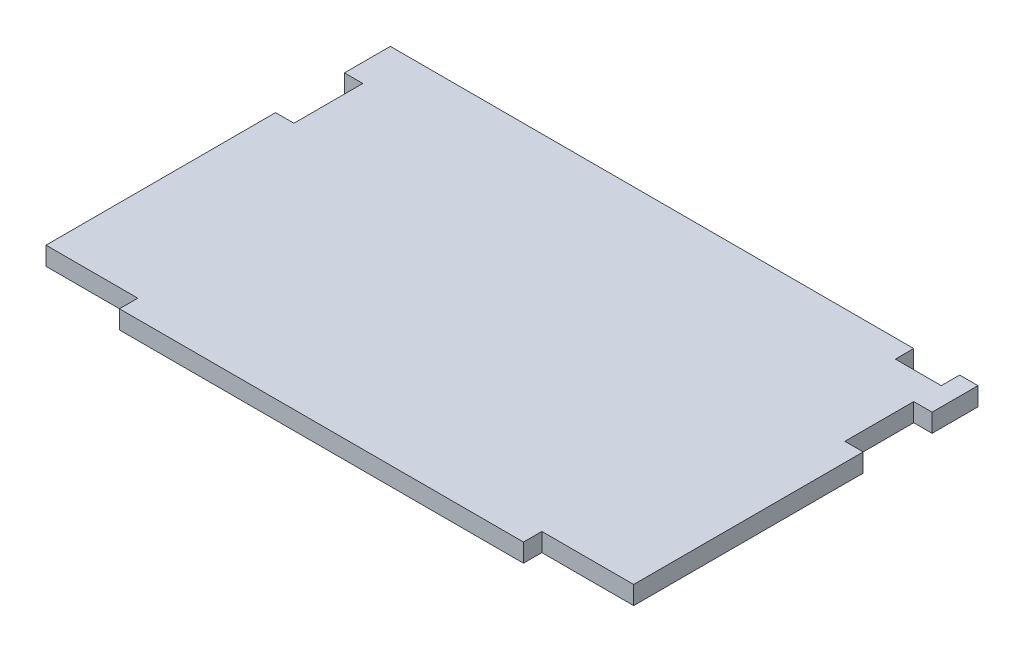
ISO-10303-21;
HEADER;
FILE_DESCRIPTION(('STEP AP214'),'2;1');
FILE_NAME('part.step','',(''),(''),'','','');
FILE_SCHEMA(('AUTOMOTIVE_DESIGN { 1 0 10303 214 1 1 1 1 }'));
ENDSEC;
DATA;
#1=APPLICATION_CONTEXT('core data for automotive mechanical design processes');
#2=APPLICATION_PROTOCOL_DEFINITION('international standard','automotive_design',2000,#1);
#3=PRODUCT_CONTEXT('',#1,'mechanical');
#4=PRODUCT('Part','Part','',(#3));
#5=PRODUCT_RELATED_PRODUCT_CATEGORY('part','',(#4));
#6=PRODUCT_DEFINITION_FORMATION('','',#4);
#7=PRODUCT_DEFINITION_CONTEXT('part definition',#1,'design');
#8=PRODUCT_DEFINITION('design','',#6,#7);
#9=PRODUCT_DEFINITION_SHAPE('','',#8);
#10=(LENGTH_UNIT() NAMED_UNIT(*) SI_UNIT(.MILLI.,.METRE.));
#11=(NAMED_UNIT(*) PLANE_ANGLE_UNIT() SI_UNIT($,.RADIAN.));
#12=(NAMED_UNIT(*) SI_UNIT($,.STERADIAN.) SOLID_ANGLE_UNIT());
#13=UNCERTAINTY_MEASURE_WITH_UNIT(LENGTH_MEASURE(1.E-05),#10,'distance_accuracy_value','');
#14=(GEOMETRIC_REPRESENTATION_CONTEXT(3) GLOBAL_UNCERTAINTY_ASSIGNED_CONTEXT((#13)) GLOBAL_UNIT_ASSIGNED_CONTEXT((#10,
#11,#12)) REPRESENTATION_CONTEXT('',''));
#15=CARTESIAN_POINT('',(0.,0.,0.));
#16=DIRECTION('',(0.,0.,1.));
#17=DIRECTION('',(1.,0.,0.));
#18=AXIS2_PLACEMENT_3D('',#15,#16,#17);
#19=CARTESIAN_POINT('',(0.,4.,0.));
#20=DIRECTION('',(1.,0.,0.));
#21=DIRECTION('',(0.,0.,-1.));
#22=AXIS2_PLACEMENT_3D('',#19,#20,#21);
#23=PLANE('',#22);
#24=DIRECTION('',(0.,0.,1.));
#25=VECTOR('',#24,1.);
#26=CARTESIAN_POINT('',(0.,0.,0.));
#27=LINE('',#26,#25);
#28=CARTESIAN_POINT('',(0.,0.,-50.));
#29=VERTEX_POINT('',#28);
#30=CARTESIAN_POINT('',(0.,0.,0.));
#31=VERTEX_POINT('',#30);
#32=EDGE_CURVE('E200',#29,#31,#27,.T.);
#33=ORIENTED_EDGE('',*,*,#32,.T.);
#34=DIRECTION('',(0.,-1.,0.));
#35=VECTOR('',#34,1.);
#36=CARTESIAN_POINT('',(0.,4.,0.));
#37=LINE('',#36,#35);
#38=CARTESIAN_POINT('',(0.,4.,0.));
#39=VERTEX_POINT('',#38);
#40=EDGE_CURVE('E11',#39,#31,#37,.T.);
#41=ORIENTED_EDGE('',*,*,#40,.F.);
#42=DIRECTION('',(0.,0.,1.));
#43=VECTOR('',#42,1.);
#44=CARTESIAN_POINT('',(0.,4.,0.));
#45=LINE('',#44,#43);
#46=CARTESIAN_POINT('',(0.,4.,-50.));
#47=VERTEX_POINT('',#46);
#48=EDGE_CURVE('E238',#47,#39,#45,.T.);
#49=ORIENTED_EDGE('',*,*,#48,.F.);
#50=DIRECTION('',(0.,-1.,0.));
#51=VECTOR('',#50,1.);
#52=CARTESIAN_POINT('',(0.,4.,-50.));
#53=LINE('',#52,#51);
#54=EDGE_CURVE('E196',#47,#29,#53,.T.);
#55=ORIENTED_EDGE('',*,*,#54,.T.);
#56=EDGE_LOOP('',(#33,#41,#49,#55));
#57=FACE_BOUND('',#56,.T.);
#58=ADVANCED_FACE('F32',(#57),#23,.F.);
#59=CARTESIAN_POINT('',(0.,4.,0.));
#60=DIRECTION('',(0.,0.,-1.));
#61=DIRECTION('',(-1.,0.,0.));
#62=AXIS2_PLACEMENT_3D('',#59,#60,#61);
#63=PLANE('',#62);
#64=DIRECTION('',(1.,0.,0.));
#65=VECTOR('',#64,1.);
#66=CARTESIAN_POINT('',(0.,0.,0.));
#67=LINE('',#66,#65);
#68=CARTESIAN_POINT('',(20.,0.,0.));
#69=VERTEX_POINT('',#68);
#70=EDGE_CURVE('E203',#31,#69,#67,.T.);
#71=ORIENTED_EDGE('',*,*,#70,.T.);
#72=DIRECTION('',(0.,-1.,0.));
#73=VECTOR('',#72,1.);
#74=CARTESIAN_POINT('',(20.,4.,0.));
#75=LINE('',#74,#73);
#76=CARTESIAN_POINT('',(20.,4.,0.));
#77=VERTEX_POINT('',#76);
#78=EDGE_CURVE('E40',#77,#69,#75,.T.);
#79=ORIENTED_EDGE('',*,*,#78,.F.);
#80=DIRECTION('',(1.,0.,0.));
#81=VECTOR('',#80,1.);
#82=CARTESIAN_POINT('',(0.,4.,0.));
#83=LINE('',#82,#81);
#84=EDGE_CURVE('E127',#39,#77,#83,.T.);
#85=ORIENTED_EDGE('',*,*,#84,.F.);
#86=ORIENTED_EDGE('',*,*,#40,.T.);
#87=EDGE_LOOP('',(#71,#79,#85,#86));
#88=FACE_BOUND('',#87,.T.);
#89=ADVANCED_FACE('F356',(#88),#63,.F.);
#90=CARTESIAN_POINT('',(20.,4.,0.));
#91=DIRECTION('',(1.,0.,0.));
#92=DIRECTION('',(0.,0.,-1.));
#93=AXIS2_PLACEMENT_3D('',#90,#91,#92);
#94=PLANE('',#93);
#95=DIRECTION('',(0.,0.,1.));
#96=VECTOR('',#95,1.);
#97=CARTESIAN_POINT('',(20.,0.,0.));
#98=LINE('',#97,#96);
#99=CARTESIAN_POINT('',(20.,0.,4.00000000000001));
#100=VERTEX_POINT('',#99);
#101=EDGE_CURVE('E205',#69,#100,#98,.T.);
#102=ORIENTED_EDGE('',*,*,#101,.T.);
#103=DIRECTION('',(0.,-1.,0.));
#104=VECTOR('',#103,1.);
#105=CARTESIAN_POINT('',(20.,4.,4.00000000000001));
#106=LINE('',#105,#104);
#107=CARTESIAN_POINT('',(20.,4.,4.00000000000001));
#108=VERTEX_POINT('',#107);
#109=EDGE_CURVE('E281',#108,#100,#106,.T.);
#110=ORIENTED_EDGE('',*,*,#109,.F.);
#111=DIRECTION('',(0.,0.,1.));
#112=VECTOR('',#111,1.);
#113=CARTESIAN_POINT('',(20.,4.,0.));
#114=LINE('',#113,#112);
#115=EDGE_CURVE('E289',#77,#108,#114,.T.);
#116=ORIENTED_EDGE('',*,*,#115,.F.);
#117=ORIENTED_EDGE('',*,*,#78,.T.);
#118=EDGE_LOOP('',(#102,#110,#116,#117));
#119=FACE_BOUND('',#118,.T.);
#120=ADVANCED_FACE('F287',(#119),#94,.F.);
#121=CARTESIAN_POINT('',(108.,4.,4.));
#122=DIRECTION('',(0.,0.,-1.));
#123=DIRECTION('',(-1.,0.,0.));
#124=AXIS2_PLACEMENT_3D('',#121,#122,#123);
#125=PLANE('',#124);
#126=DIRECTION('',(1.,0.,0.));
#127=VECTOR('',#126,1.);
#128=CARTESIAN_POINT('',(108.,0.,4.));
#129=LINE('',#128,#127);
#130=CARTESIAN_POINT('',(108.,0.,4.));
#131=VERTEX_POINT('',#130);
#132=EDGE_CURVE('E207',#100,#131,#129,.T.);
#133=ORIENTED_EDGE('',*,*,#132,.T.);
#134=DIRECTION('',(0.,-1.,0.));
#135=VECTOR('',#134,1.);
#136=CARTESIAN_POINT('',(108.,4.,4.));
#137=LINE('',#136,#135);
#138=CARTESIAN_POINT('',(108.,4.,4.));
#139=VERTEX_POINT('',#138);
#140=EDGE_CURVE('E278',#139,#131,#137,.T.);
#141=ORIENTED_EDGE('',*,*,#140,.F.);
#142=DIRECTION('',(1.,0.,0.));
#143=VECTOR('',#142,1.);
#144=CARTESIAN_POINT('',(108.,4.,4.));
#145=LINE('',#144,#143);
#146=EDGE_CURVE('E307',#108,#139,#145,.T.);
#147=ORIENTED_EDGE('',*,*,#146,.F.);
#148=ORIENTED_EDGE('',*,*,#109,.T.);
#149=EDGE_LOOP('',(#133,#141,#147,#148));
#150=FACE_BOUND('',#149,.T.);
#151=ADVANCED_FACE('F298',(#150),#125,.F.);
#152=CARTESIAN_POINT('',(108.,4.,0.));
#153=DIRECTION('',(-1.,0.,0.));
#154=DIRECTION('',(0.,0.,1.));
#155=AXIS2_PLACEMENT_3D('',#152,#153,#154);
#156=PLANE('',#155);
#157=DIRECTION('',(0.,0.,-1.));
#158=VECTOR('',#157,1.);
#159=CARTESIAN_POINT('',(108.,0.,0.));
#160=LINE('',#159,#158);
#161=CARTESIAN_POINT('',(108.,0.,0.));
#162=VERTEX_POINT('',#161);
#163=EDGE_CURVE('E209',#131,#162,#160,.T.);
#164=ORIENTED_EDGE('',*,*,#163,.T.);
#165=DIRECTION('',(0.,-1.,0.));
#166=VECTOR('',#165,1.);
#167=CARTESIAN_POINT('',(108.,4.,0.));
#168=LINE('',#167,#166);
#169=CARTESIAN_POINT('',(108.,4.,0.));
#170=VERTEX_POINT('',#169);
#171=EDGE_CURVE('E275',#170,#162,#168,.T.);
#172=ORIENTED_EDGE('',*,*,#171,.F.);
#173=DIRECTION('',(0.,0.,-1.));
#174=VECTOR('',#173,1.);
#175=CARTESIAN_POINT('',(108.,4.,0.));
#176=LINE('',#175,#174);
#177=EDGE_CURVE('E304',#139,#170,#176,.T.);
#178=ORIENTED_EDGE('',*,*,#177,.F.);
#179=ORIENTED_EDGE('',*,*,#140,.T.);
#180=EDGE_LOOP('',(#164,#172,#178,#179));
#181=FACE_BOUND('',#180,.T.);
#182=ADVANCED_FACE('F302',(#181),#156,.F.);
#183=CARTESIAN_POINT('',(108.,4.,0.));
#184=DIRECTION('',(0.,0.,-1.));
#185=DIRECTION('',(-1.,0.,0.));
#186=AXIS2_PLACEMENT_3D('',#183,#184,#185);
#187=PLANE('',#186);
#188=DIRECTION('',(1.,0.,0.));
#189=VECTOR('',#188,1.);
#190=CARTESIAN_POINT('',(108.,0.,0.));
#191=LINE('',#190,#189);
#192=CARTESIAN_POINT('',(128.,0.,0.));
#193=VERTEX_POINT('',#192);
#194=EDGE_CURVE('E211',#162,#193,#191,.T.);
#195=ORIENTED_EDGE('',*,*,#194,.T.);
#196=DIRECTION('',(0.,-1.,0.));
#197=VECTOR('',#196,1.);
#198=CARTESIAN_POINT('',(128.,4.,0.));
#199=LINE('',#198,#197);
#200=CARTESIAN_POINT('',(128.,4.,0.));
#201=VERTEX_POINT('',#200);
#202=EDGE_CURVE('E272',#201,#193,#199,.T.);
#203=ORIENTED_EDGE('',*,*,#202,.F.);
#204=DIRECTION('',(1.,0.,0.));
#205=VECTOR('',#204,1.);
#206=CARTESIAN_POINT('',(108.,4.,0.));
#207=LINE('',#206,#205);
#208=EDGE_CURVE('E306',#170,#201,#207,.T.);
#209=ORIENTED_EDGE('',*,*,#208,.F.);
#210=ORIENTED_EDGE('',*,*,#171,.T.);
#211=EDGE_LOOP('',(#195,#203,#209,#210));
#212=FACE_BOUND('',#211,.T.);
#213=ADVANCED_FACE('F369',(#212),#187,.F.);
#214=CARTESIAN_POINT('',(128.,4.,0.));
#215=DIRECTION('',(-1.,0.,0.));
#216=DIRECTION('',(0.,0.,1.));
#217=AXIS2_PLACEMENT_3D('',#214,#215,#216);
#218=PLANE('',#217);
#219=DIRECTION('',(0.,0.,-1.));
#220=VECTOR('',#219,1.);
#221=CARTESIAN_POINT('',(128.,0.,0.));
#222=LINE('',#221,#220);
#223=CARTESIAN_POINT('',(128.,0.,-50.));
#224=VERTEX_POINT('',#223);
#225=EDGE_CURVE('E213',#193,#224,#222,.T.);
#226=ORIENTED_EDGE('',*,*,#225,.T.);
#227=DIRECTION('',(0.,-1.,0.));
#228=VECTOR('',#227,1.);
#229=CARTESIAN_POINT('',(128.,4.,-50.));
#230=LINE('',#229,#228);
#231=CARTESIAN_POINT('',(128.,4.,-50.));
#232=VERTEX_POINT('',#231);
#233=EDGE_CURVE('E269',#232,#224,#230,.T.);
#234=ORIENTED_EDGE('',*,*,#233,.F.);
#235=DIRECTION('',(0.,0.,-1.));
#236=VECTOR('',#235,1.);
#237=CARTESIAN_POINT('',(128.,4.,0.));
#238=LINE('',#237,#236);
#239=EDGE_CURVE('E309',#201,#232,#238,.T.);
#240=ORIENTED_EDGE('',*,*,#239,.F.);
#241=ORIENTED_EDGE('',*,*,#202,.T.);
#242=EDGE_LOOP('',(#226,#234,#240,#241));
#243=FACE_BOUND('',#242,.T.);
#244=ADVANCED_FACE('F372',(#243),#218,.F.);
#245=CARTESIAN_POINT('',(124.,4.,-50.));
#246=DIRECTION('',(0.,0.,1.));
#247=DIRECTION('',(1.,0.,0.));
#248=AXIS2_PLACEMENT_3D('',#245,#246,#247);
#249=PLANE('',#248);
#250=DIRECTION('',(-1.,0.,0.));
#251=VECTOR('',#250,1.);
#252=CARTESIAN_POINT('',(124.,0.,-50.));
#253=LINE('',#252,#251);
#254=CARTESIAN_POINT('',(124.,0.,-50.));
#255=VERTEX_POINT('',#254);
#256=EDGE_CURVE('E215',#224,#255,#253,.T.);
#257=ORIENTED_EDGE('',*,*,#256,.T.);
#258=DIRECTION('',(0.,-1.,0.));
#259=VECTOR('',#258,1.);
#260=CARTESIAN_POINT('',(124.,4.,-50.));
#261=LINE('',#260,#259);
#262=CARTESIAN_POINT('',(124.,4.,-50.));
#263=VERTEX_POINT('',#262);
#264=EDGE_CURVE('E266',#263,#255,#261,.T.);
#265=ORIENTED_EDGE('',*,*,#264,.F.);
#266=DIRECTION('',(-1.,0.,0.));
#267=VECTOR('',#266,1.);
#268=CARTESIAN_POINT('',(124.,4.,-50.));
#269=LINE('',#268,#267);
#270=EDGE_CURVE('E315',#232,#263,#269,.T.);
#271=ORIENTED_EDGE('',*,*,#270,.F.);
#272=ORIENTED_EDGE('',*,*,#233,.T.);
#273=EDGE_LOOP('',(#257,#265,#271,#272));
#274=FACE_BOUND('',#273,.T.);
#275=ADVANCED_FACE('F376',(#274),#249,.F.);
#276=CARTESIAN_POINT('',(124.,4.,-65.));
#277=DIRECTION('',(-1.,0.,0.));
#278=DIRECTION('',(0.,0.,1.));
#279=AXIS2_PLACEMENT_3D('',#276,#277,#278);
#280=PLANE('',#279);
#281=DIRECTION('',(0.,0.,-1.));
#282=VECTOR('',#281,1.);
#283=CARTESIAN_POINT('',(124.,0.,-65.));
#284=LINE('',#283,#282);
#285=CARTESIAN_POINT('',(124.,0.,-65.));
#286=VERTEX_POINT('',#285);
#287=EDGE_CURVE('E217',#255,#286,#284,.T.);
#288=ORIENTED_EDGE('',*,*,#287,.T.);
#289=DIRECTION('',(0.,-1.,0.));
#290=VECTOR('',#289,1.);
#291=CARTESIAN_POINT('',(124.,4.,-65.));
#292=LINE('',#291,#290);
#293=CARTESIAN_POINT('',(124.,4.,-65.));
#294=VERTEX_POINT('',#293);
#295=EDGE_CURVE('E263',#294,#286,#292,.T.);
#296=ORIENTED_EDGE('',*,*,#295,.F.);
#297=DIRECTION('',(0.,0.,-1.));
#298=VECTOR('',#297,1.);
#299=CARTESIAN_POINT('',(124.,4.,-65.));
#300=LINE('',#299,#298);
#301=EDGE_CURVE('E317',#263,#294,#300,.T.);
#302=ORIENTED_EDGE('',*,*,#301,.F.);
#303=ORIENTED_EDGE('',*,*,#264,.T.);
#304=EDGE_LOOP('',(#288,#296,#302,#303));
#305=FACE_BOUND('',#304,.T.);
#306=ADVANCED_FACE('F380',(#305),#280,.F.);
#307=CARTESIAN_POINT('',(128.,4.,-65.));
#308=DIRECTION('',(0.,0.,-1.));
#309=DIRECTION('',(-1.,0.,0.));
#310=AXIS2_PLACEMENT_3D('',#307,#308,#309);
#311=PLANE('',#310);
#312=DIRECTION('',(1.,0.,0.));
#313=VECTOR('',#312,1.);
#314=CARTESIAN_POINT('',(128.,0.,-65.));
#315=LINE('',#314,#313);
#316=CARTESIAN_POINT('',(128.,0.,-65.));
#317=VERTEX_POINT('',#316);
#318=EDGE_CURVE('E219',#286,#317,#315,.T.);
#319=ORIENTED_EDGE('',*,*,#318,.T.);
#320=DIRECTION('',(0.,-1.,0.));
#321=VECTOR('',#320,1.);
#322=CARTESIAN_POINT('',(128.,4.,-65.));
#323=LINE('',#322,#321);
#324=CARTESIAN_POINT('',(128.,4.,-65.));
#325=VERTEX_POINT('',#324);
#326=EDGE_CURVE('E260',#325,#317,#323,.T.);
#327=ORIENTED_EDGE('',*,*,#326,.F.);
#328=DIRECTION('',(1.,0.,0.));
#329=VECTOR('',#328,1.);
#330=CARTESIAN_POINT('',(128.,4.,-65.));
#331=LINE('',#330,#329);
#332=EDGE_CURVE('E319',#294,#325,#331,.T.);
#333=ORIENTED_EDGE('',*,*,#332,.F.);
#334=ORIENTED_EDGE('',*,*,#295,.T.);
#335=EDGE_LOOP('',(#319,#327,#333,#334));
#336=FACE_BOUND('',#335,.T.);
#337=ADVANCED_FACE('F384',(#336),#311,.F.);
#338=CARTESIAN_POINT('',(128.,4.,-65.));
#339=DIRECTION('',(-1.,0.,0.));
#340=DIRECTION('',(0.,0.,1.));
#341=AXIS2_PLACEMENT_3D('',#338,#339,#340);
#342=PLANE('',#341);
#343=DIRECTION('',(0.,0.,-1.));
#344=VECTOR('',#343,1.);
#345=CARTESIAN_POINT('',(128.,0.,-65.));
#346=LINE('',#345,#344);
#347=CARTESIAN_POINT('',(128.,0.,-75.));
#348=VERTEX_POINT('',#347);
#349=EDGE_CURVE('E221',#317,#348,#346,.T.);
#350=ORIENTED_EDGE('',*,*,#349,.T.);
#351=DIRECTION('',(0.,-1.,0.));
#352=VECTOR('',#351,1.);
#353=CARTESIAN_POINT('',(128.,4.,-75.));
#354=LINE('',#353,#352);
#355=CARTESIAN_POINT('',(128.,4.,-75.));
#356=VERTEX_POINT('',#355);
#357=EDGE_CURVE('E257',#356,#348,#354,.T.);
#358=ORIENTED_EDGE('',*,*,#357,.F.);
#359=DIRECTION('',(0.,0.,-1.));
#360=VECTOR('',#359,1.);
#361=CARTESIAN_POINT('',(128.,4.,-65.));
#362=LINE('',#361,#360);
#363=EDGE_CURVE('E321',#325,#356,#362,.T.);
#364=ORIENTED_EDGE('',*,*,#363,.F.);
#365=ORIENTED_EDGE('',*,*,#326,.T.);
#366=EDGE_LOOP('',(#350,#358,#364,#365));
#367=FACE_BOUND('',#366,.T.);
#368=ADVANCED_FACE('F388',(#367),#342,.F.);
#369=CARTESIAN_POINT('',(124.,4.,-75.));
#370=DIRECTION('',(0.,0.,1.));
#371=DIRECTION('',(1.,0.,0.));
#372=AXIS2_PLACEMENT_3D('',#369,#370,#371);
#373=PLANE('',#372);
#374=DIRECTION('',(-1.,0.,0.));
#375=VECTOR('',#374,1.);
#376=CARTESIAN_POINT('',(124.,0.,-75.));
#377=LINE('',#376,#375);
#378=CARTESIAN_POINT('',(124.,0.,-75.));
#379=VERTEX_POINT('',#378);
#380=EDGE_CURVE('E223',#348,#379,#377,.T.);
#381=ORIENTED_EDGE('',*,*,#380,.T.);
#382=DIRECTION('',(0.,-1.,0.));
#383=VECTOR('',#382,1.);
#384=CARTESIAN_POINT('',(124.,4.,-75.));
#385=LINE('',#384,#383);
#386=CARTESIAN_POINT('',(124.,4.,-75.));
#387=VERTEX_POINT('',#386);
#388=EDGE_CURVE('E254',#387,#379,#385,.T.);
#389=ORIENTED_EDGE('',*,*,#388,.F.);
#390=DIRECTION('',(-1.,0.,0.));
#391=VECTOR('',#390,1.);
#392=CARTESIAN_POINT('',(124.,4.,-75.));
#393=LINE('',#392,#391);
#394=EDGE_CURVE('E323',#356,#387,#393,.T.);
#395=ORIENTED_EDGE('',*,*,#394,.F.);
#396=ORIENTED_EDGE('',*,*,#357,.T.);
#397=EDGE_LOOP('',(#381,#389,#395,#396));
#398=FACE_BOUND('',#397,.T.);
#399=ADVANCED_FACE('F392',(#398),#373,.F.);
#400=CARTESIAN_POINT('',(124.,4.,-75.));
#401=DIRECTION('',(1.,0.,0.));
#402=DIRECTION('',(0.,0.,-1.));
#403=AXIS2_PLACEMENT_3D('',#400,#401,#402);
#404=PLANE('',#403);
#405=DIRECTION('',(0.,0.,1.));
#406=VECTOR('',#405,1.);
#407=CARTESIAN_POINT('',(124.,0.,-75.));
#408=LINE('',#407,#406);
#409=CARTESIAN_POINT('',(124.,0.,-71.));
#410=VERTEX_POINT('',#409);
#411=EDGE_CURVE('E225',#379,#410,#408,.T.);
#412=ORIENTED_EDGE('',*,*,#411,.T.);
#413=DIRECTION('',(0.,-1.,0.));
#414=VECTOR('',#413,1.);
#415=CARTESIAN_POINT('',(124.,4.,-71.));
#416=LINE('',#415,#414);
#417=CARTESIAN_POINT('',(124.,4.,-71.));
#418=VERTEX_POINT('',#417);
#419=EDGE_CURVE('E251',#418,#410,#416,.T.);
#420=ORIENTED_EDGE('',*,*,#419,.F.);
#421=DIRECTION('',(0.,0.,1.));
#422=VECTOR('',#421,1.);
#423=CARTESIAN_POINT('',(124.,4.,-75.));
#424=LINE('',#423,#422);
#425=EDGE_CURVE('E325',#387,#418,#424,.T.);
#426=ORIENTED_EDGE('',*,*,#425,.F.);
#427=ORIENTED_EDGE('',*,*,#388,.T.);
#428=EDGE_LOOP('',(#412,#420,#426,#427));
#429=FACE_BOUND('',#428,.T.);
#430=ADVANCED_FACE('F396',(#429),#404,.F.);
#431=CARTESIAN_POINT('',(114.,4.,-71.));
#432=DIRECTION('',(0.,0.,1.));
#433=DIRECTION('',(1.,0.,0.));
#434=AXIS2_PLACEMENT_3D('',#431,#432,#433);
#435=PLANE('',#434);
#436=DIRECTION('',(-1.,0.,0.));
#437=VECTOR('',#436,1.);
#438=CARTESIAN_POINT('',(114.,0.,-71.));
#439=LINE('',#438,#437);
#440=CARTESIAN_POINT('',(114.,0.,-71.));
#441=VERTEX_POINT('',#440);
#442=EDGE_CURVE('E227',#410,#441,#439,.T.);
#443=ORIENTED_EDGE('',*,*,#442,.T.);
#444=DIRECTION('',(0.,-1.,0.));
#445=VECTOR('',#444,1.);
#446=CARTESIAN_POINT('',(114.,4.,-71.));
#447=LINE('',#446,#445);
#448=CARTESIAN_POINT('',(114.,4.,-71.));
#449=VERTEX_POINT('',#448);
#450=EDGE_CURVE('E248',#449,#441,#447,.T.);
#451=ORIENTED_EDGE('',*,*,#450,.F.);
#452=DIRECTION('',(-1.,0.,0.));
#453=VECTOR('',#452,1.);
#454=CARTESIAN_POINT('',(114.,4.,-71.));
#455=LINE('',#454,#453);
#456=EDGE_CURVE('E327',#418,#449,#455,.T.);
#457=ORIENTED_EDGE('',*,*,#456,.F.);
#458=ORIENTED_EDGE('',*,*,#419,.T.);
#459=EDGE_LOOP('',(#443,#451,#457,#458));
#460=FACE_BOUND('',#459,.T.);
#461=ADVANCED_FACE('F400',(#460),#435,.F.);
#462=CARTESIAN_POINT('',(114.,4.,-75.));
#463=DIRECTION('',(-1.,0.,0.));
#464=DIRECTION('',(0.,0.,1.));
#465=AXIS2_PLACEMENT_3D('',#462,#463,#464);
#466=PLANE('',#465);
#467=DIRECTION('',(0.,0.,-1.));
#468=VECTOR('',#467,1.);
#469=CARTESIAN_POINT('',(114.,0.,-75.));
#470=LINE('',#469,#468);
#471=CARTESIAN_POINT('',(114.,0.,-75.));
#472=VERTEX_POINT('',#471);
#473=EDGE_CURVE('E229',#441,#472,#470,.T.);
#474=ORIENTED_EDGE('',*,*,#473,.T.);
#475=DIRECTION('',(0.,-1.,0.));
#476=VECTOR('',#475,1.);
#477=CARTESIAN_POINT('',(114.,4.,-75.));
#478=LINE('',#477,#476);
#479=CARTESIAN_POINT('',(114.,4.,-75.));
#480=VERTEX_POINT('',#479);
#481=EDGE_CURVE('E245',#480,#472,#478,.T.);
#482=ORIENTED_EDGE('',*,*,#481,.F.);
#483=DIRECTION('',(0.,0.,-1.));
#484=VECTOR('',#483,1.);
#485=CARTESIAN_POINT('',(114.,4.,-75.));
#486=LINE('',#485,#484);
#487=EDGE_CURVE('E329',#449,#480,#486,.T.);
#488=ORIENTED_EDGE('',*,*,#487,.F.);
#489=ORIENTED_EDGE('',*,*,#450,.T.);
#490=EDGE_LOOP('',(#474,#482,#488,#489));
#491=FACE_BOUND('',#490,.T.);
#492=ADVANCED_FACE('F404',(#491),#466,.F.);
#493=CARTESIAN_POINT('',(0.,4.,-75.));
#494=DIRECTION('',(0.,0.,1.));
#495=DIRECTION('',(1.,0.,0.));
#496=AXIS2_PLACEMENT_3D('',#493,#494,#495);
#497=PLANE('',#496);
#498=DIRECTION('',(-1.,0.,0.));
#499=VECTOR('',#498,1.);
#500=CARTESIAN_POINT('',(0.,0.,-75.));
#501=LINE('',#500,#499);
#502=CARTESIAN_POINT('',(0.,0.,-75.));
#503=VERTEX_POINT('',#502);
#504=EDGE_CURVE('E231',#472,#503,#501,.T.);
#505=ORIENTED_EDGE('',*,*,#504,.T.);
#506=DIRECTION('',(0.,-1.,0.));
#507=VECTOR('',#506,1.);
#508=CARTESIAN_POINT('',(0.,4.,-75.));
#509=LINE('',#508,#507);
#510=CARTESIAN_POINT('',(0.,4.,-75.));
#511=VERTEX_POINT('',#510);
#512=EDGE_CURVE('E242',#511,#503,#509,.T.);
#513=ORIENTED_EDGE('',*,*,#512,.F.);
#514=DIRECTION('',(-1.,0.,0.));
#515=VECTOR('',#514,1.);
#516=CARTESIAN_POINT('',(0.,4.,-75.));
#517=LINE('',#516,#515);
#518=EDGE_CURVE('E331',#480,#511,#517,.T.);
#519=ORIENTED_EDGE('',*,*,#518,.F.);
#520=ORIENTED_EDGE('',*,*,#481,.T.);
#521=EDGE_LOOP('',(#505,#513,#519,#520));
#522=FACE_BOUND('',#521,.T.);
#523=ADVANCED_FACE('F337',(#522),#497,.F.);
#524=CARTESIAN_POINT('',(0.,4.,-65.));
#525=DIRECTION('',(1.,0.,0.));
#526=DIRECTION('',(0.,0.,-1.));
#527=AXIS2_PLACEMENT_3D('',#524,#525,#526);
#528=PLANE('',#527);
#529=DIRECTION('',(0.,0.,1.));
#530=VECTOR('',#529,1.);
#531=CARTESIAN_POINT('',(0.,0.,-65.));
#532=LINE('',#531,#530);
#533=CARTESIAN_POINT('',(0.,0.,-65.));
#534=VERTEX_POINT('',#533);
#535=EDGE_CURVE('E233',#503,#534,#532,.T.);
#536=ORIENTED_EDGE('',*,*,#535,.T.);
#537=DIRECTION('',(0.,-1.,0.));
#538=VECTOR('',#537,1.);
#539=CARTESIAN_POINT('',(0.,4.,-65.));
#540=LINE('',#539,#538);
#541=CARTESIAN_POINT('',(0.,4.,-65.));
#542=VERTEX_POINT('',#541);
#543=EDGE_CURVE('E191',#542,#534,#540,.T.);
#544=ORIENTED_EDGE('',*,*,#543,.F.);
#545=DIRECTION('',(0.,0.,1.));
#546=VECTOR('',#545,1.);
#547=CARTESIAN_POINT('',(0.,4.,-65.));
#548=LINE('',#547,#546);
#549=EDGE_CURVE('E182',#511,#542,#548,.T.);
#550=ORIENTED_EDGE('',*,*,#549,.F.);
#551=ORIENTED_EDGE('',*,*,#512,.T.);
#552=EDGE_LOOP('',(#536,#544,#550,#551));
#553=FACE_BOUND('',#552,.T.);
#554=ADVANCED_FACE('F341',(#553),#528,.F.);
#555=CARTESIAN_POINT('',(0.,4.,-65.));
#556=DIRECTION('',(0.,0.,-1.));
#557=DIRECTION('',(-1.,0.,0.));
#558=AXIS2_PLACEMENT_3D('',#555,#556,#557);
#559=PLANE('',#558);
#560=DIRECTION('',(1.,0.,0.));
#561=VECTOR('',#560,1.);
#562=CARTESIAN_POINT('',(0.,0.,-65.));
#563=LINE('',#562,#561);
#564=CARTESIAN_POINT('',(4.,0.,-65.));
#565=VERTEX_POINT('',#564);
#566=EDGE_CURVE('E190',#534,#565,#563,.T.);
#567=ORIENTED_EDGE('',*,*,#566,.T.);
#568=DIRECTION('',(0.,-1.,0.));
#569=VECTOR('',#568,1.);
#570=CARTESIAN_POINT('',(4.,4.,-65.));
#571=LINE('',#570,#569);
#572=CARTESIAN_POINT('',(4.,4.,-65.));
#573=VERTEX_POINT('',#572);
#574=EDGE_CURVE('E187',#573,#565,#571,.T.);
#575=ORIENTED_EDGE('',*,*,#574,.F.);
#576=DIRECTION('',(1.,0.,0.));
#577=VECTOR('',#576,1.);
#578=CARTESIAN_POINT('',(0.,4.,-65.));
#579=LINE('',#578,#577);
#580=EDGE_CURVE('E176',#542,#573,#579,.T.);
#581=ORIENTED_EDGE('',*,*,#580,.F.);
#582=ORIENTED_EDGE('',*,*,#543,.T.);
#583=EDGE_LOOP('',(#567,#575,#581,#582));
#584=FACE_BOUND('',#583,.T.);
#585=ADVANCED_FACE('F188',(#584),#559,.F.);
#586=CARTESIAN_POINT('',(4.,4.,-65.));
#587=DIRECTION('',(1.,0.,0.));
#588=DIRECTION('',(0.,0.,-1.));
#589=AXIS2_PLACEMENT_3D('',#586,#587,#588);
#590=PLANE('',#589);
#591=DIRECTION('',(0.,0.,1.));
#592=VECTOR('',#591,1.);
#593=CARTESIAN_POINT('',(4.,0.,-65.));
#594=LINE('',#593,#592);
#595=CARTESIAN_POINT('',(4.,0.,-50.));
#596=VERTEX_POINT('',#595);
#597=EDGE_CURVE('E113',#565,#596,#594,.T.);
#598=ORIENTED_EDGE('',*,*,#597,.T.);
#599=DIRECTION('',(0.,-1.,0.));
#600=VECTOR('',#599,1.);
#601=CARTESIAN_POINT('',(4.,4.,-50.));
#602=LINE('',#601,#600);
#603=CARTESIAN_POINT('',(4.,4.,-50.));
#604=VERTEX_POINT('',#603);
#605=EDGE_CURVE('E192',#604,#596,#602,.T.);
#606=ORIENTED_EDGE('',*,*,#605,.F.);
#607=DIRECTION('',(0.,0.,1.));
#608=VECTOR('',#607,1.);
#609=CARTESIAN_POINT('',(4.,4.,-65.));
#610=LINE('',#609,#608);
#611=EDGE_CURVE('E180',#573,#604,#610,.T.);
#612=ORIENTED_EDGE('',*,*,#611,.F.);
#613=ORIENTED_EDGE('',*,*,#574,.T.);
#614=EDGE_LOOP('',(#598,#606,#612,#613));
#615=FACE_BOUND('',#614,.T.);
#616=ADVANCED_FACE('F194',(#615),#590,.F.);
#617=CARTESIAN_POINT('',(4.,4.,-50.));
#618=DIRECTION('',(0.,0.,1.));
#619=DIRECTION('',(1.,0.,0.));
#620=AXIS2_PLACEMENT_3D('',#617,#618,#619);
#621=PLANE('',#620);
#622=DIRECTION('',(-1.,0.,0.));
#623=VECTOR('',#622,1.);
#624=CARTESIAN_POINT('',(4.,0.,-50.));
#625=LINE('',#624,#623);
#626=EDGE_CURVE('E119',#596,#29,#625,.T.);
#627=ORIENTED_EDGE('',*,*,#626,.T.);
#628=ORIENTED_EDGE('',*,*,#54,.F.);
#629=DIRECTION('',(-1.,0.,0.));
#630=VECTOR('',#629,1.);
#631=CARTESIAN_POINT('',(4.,4.,-50.));
#632=LINE('',#631,#630);
#633=EDGE_CURVE('E48',#604,#47,#632,.T.);
#634=ORIENTED_EDGE('',*,*,#633,.F.);
#635=ORIENTED_EDGE('',*,*,#605,.T.);
#636=EDGE_LOOP('',(#627,#628,#634,#635));
#637=FACE_BOUND('',#636,.T.);
#638=ADVANCED_FACE('F345',(#637),#621,.F.);
#639=CARTESIAN_POINT('',(0.,4.,0.));
#640=DIRECTION('',(0.,1.,0.));
#641=DIRECTION('',(0.,0.,1.));
#642=AXIS2_PLACEMENT_3D('',#639,#640,#641);
#643=PLANE('',#642);
#644=ORIENTED_EDGE('',*,*,#48,.T.);
#645=ORIENTED_EDGE('',*,*,#84,.T.);
#646=ORIENTED_EDGE('',*,*,#115,.T.);
#647=ORIENTED_EDGE('',*,*,#146,.T.);
#648=ORIENTED_EDGE('',*,*,#177,.T.);
#649=ORIENTED_EDGE('',*,*,#208,.T.);
#650=ORIENTED_EDGE('',*,*,#239,.T.);
#651=ORIENTED_EDGE('',*,*,#270,.T.);
#652=ORIENTED_EDGE('',*,*,#301,.T.);
#653=ORIENTED_EDGE('',*,*,#332,.T.);
#654=ORIENTED_EDGE('',*,*,#363,.T.);
#655=ORIENTED_EDGE('',*,*,#394,.T.);
#656=ORIENTED_EDGE('',*,*,#425,.T.);
#657=ORIENTED_EDGE('',*,*,#456,.T.);
#658=ORIENTED_EDGE('',*,*,#487,.T.);
#659=ORIENTED_EDGE('',*,*,#518,.T.);
#660=ORIENTED_EDGE('',*,*,#549,.T.);
#661=ORIENTED_EDGE('',*,*,#580,.T.);
#662=ORIENTED_EDGE('',*,*,#611,.T.);
#663=ORIENTED_EDGE('',*,*,#633,.T.);
#664=EDGE_LOOP('',(#644,#645,#646,#647,#648,#649,#650,#651,#652,#653,#654,#655,#656,#657,#658,
#659,#660,#661,#662,#663));
#665=FACE_BOUND('',#664,.T.);
#666=ADVANCED_FACE('F178',(#665),#643,.T.);
#667=CARTESIAN_POINT('',(0.,0.,0.));
#668=DIRECTION('',(0.,1.,0.));
#669=DIRECTION('',(0.,0.,1.));
#670=AXIS2_PLACEMENT_3D('',#667,#668,#669);
#671=PLANE('',#670);
#672=ORIENTED_EDGE('',*,*,#32,.F.);
#673=ORIENTED_EDGE('',*,*,#626,.F.);
#674=ORIENTED_EDGE('',*,*,#597,.F.);
#675=ORIENTED_EDGE('',*,*,#566,.F.);
#676=ORIENTED_EDGE('',*,*,#535,.F.);
#677=ORIENTED_EDGE('',*,*,#504,.F.);
#678=ORIENTED_EDGE('',*,*,#473,.F.);
#679=ORIENTED_EDGE('',*,*,#442,.F.);
#680=ORIENTED_EDGE('',*,*,#411,.F.);
#681=ORIENTED_EDGE('',*,*,#380,.F.);
#682=ORIENTED_EDGE('',*,*,#349,.F.);
#683=ORIENTED_EDGE('',*,*,#318,.F.);
#684=ORIENTED_EDGE('',*,*,#287,.F.);
#685=ORIENTED_EDGE('',*,*,#256,.F.);
#686=ORIENTED_EDGE('',*,*,#225,.F.);
#687=ORIENTED_EDGE('',*,*,#194,.F.);
#688=ORIENTED_EDGE('',*,*,#163,.F.);
#689=ORIENTED_EDGE('',*,*,#132,.F.);
#690=ORIENTED_EDGE('',*,*,#101,.F.);
#691=ORIENTED_EDGE('',*,*,#70,.F.);
#692=EDGE_LOOP('',(#672,#673,#674,#675,#676,#677,#678,#679,#680,#681,#682,#683,#684,#685,#686,
#687,#688,#689,#690,#691));
#693=FACE_BOUND('',#692,.T.);
#694=ADVANCED_FACE('F293',(#693),#671,.F.);
#695=CLOSED_SHELL('',(#58,#89,#120,#151,#182,#213,#244,#275,#306,#337,#368,#399,#430,#461,#492,
#523,#554,#585,#616,#638,#666,#694));
#696=MANIFOLD_SOLID_BREP('B2',#695);
#697=ADVANCED_BREP_SHAPE_REPRESENTATION('',(#18,#696),#14);
#698=SHAPE_DEFINITION_REPRESENTATION(#9,#697);
ENDSEC;
END-ISO-10303-21;
